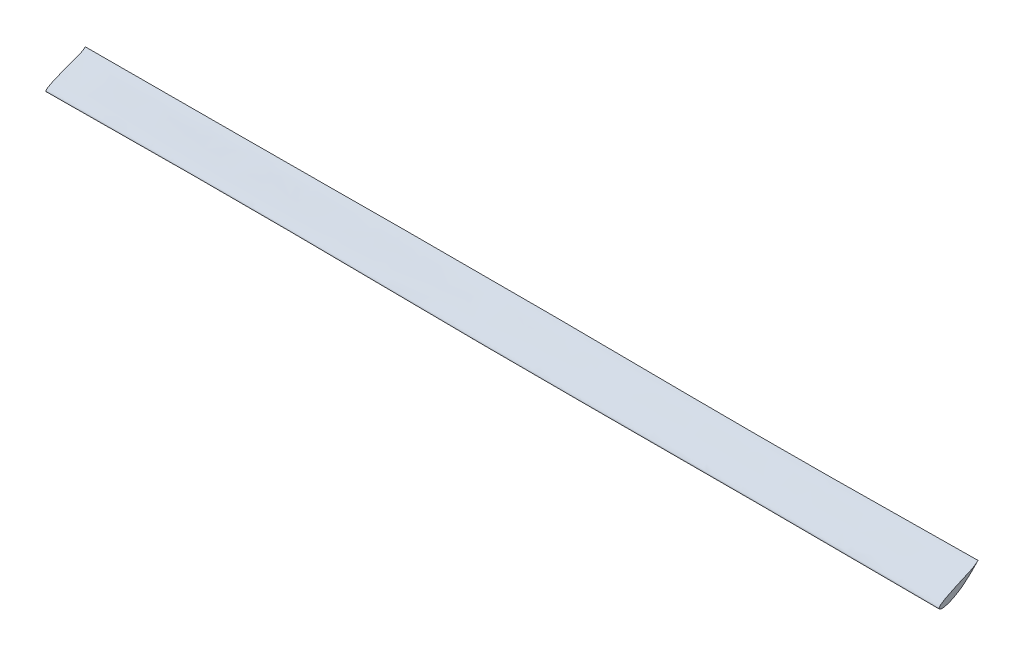
ISO-10303-21;
HEADER;
FILE_DESCRIPTION(('STEP AP214'),'2;1');
FILE_NAME('part.step','',(''),(''),'','','');
FILE_SCHEMA(('AUTOMOTIVE_DESIGN { 1 0 10303 214 1 1 1 1 }'));
ENDSEC;
DATA;
#1=APPLICATION_CONTEXT('core data for automotive mechanical design processes');
#2=APPLICATION_PROTOCOL_DEFINITION('international standard','automotive_design',2000,#1);
#3=PRODUCT_CONTEXT('',#1,'mechanical');
#4=PRODUCT('Part','Part','',(#3));
#5=PRODUCT_RELATED_PRODUCT_CATEGORY('part','',(#4));
#6=PRODUCT_DEFINITION_FORMATION('','',#4);
#7=PRODUCT_DEFINITION_CONTEXT('part definition',#1,'design');
#8=PRODUCT_DEFINITION('design','',#6,#7);
#9=PRODUCT_DEFINITION_SHAPE('','',#8);
#10=(LENGTH_UNIT() NAMED_UNIT(*) SI_UNIT(.MILLI.,.METRE.));
#11=(NAMED_UNIT(*) PLANE_ANGLE_UNIT() SI_UNIT($,.RADIAN.));
#12=(NAMED_UNIT(*) SI_UNIT($,.STERADIAN.) SOLID_ANGLE_UNIT());
#13=UNCERTAINTY_MEASURE_WITH_UNIT(LENGTH_MEASURE(1.E-05),#10,'distance_accuracy_value','');
#14=(GEOMETRIC_REPRESENTATION_CONTEXT(3) GLOBAL_UNCERTAINTY_ASSIGNED_CONTEXT((#13)) GLOBAL_UNIT_ASSIGNED_CONTEXT((#10,
#11,#12)) REPRESENTATION_CONTEXT('',''));
#15=CARTESIAN_POINT('',(0.,0.,0.));
#16=DIRECTION('',(0.,0.,1.));
#17=DIRECTION('',(1.,0.,0.));
#18=AXIS2_PLACEMENT_3D('',#15,#16,#17);
#19=CARTESIAN_POINT('',(997.019750859984,23.5445932351853,-31.5919798363942));
#20=DIRECTION('',(1.,0.,0.));
#21=DIRECTION('',(0.,0.,-1.));
#22=AXIS2_PLACEMENT_3D('',#19,#20,#21);
#23=PLANE('',#22);
#24=CARTESIAN_POINT('',(997.019750859984,35.4339005781969,-54.10357532692));
#25=CARTESIAN_POINT('',(997.019750859984,34.2381881895794,-52.8955230255901));
#26=CARTESIAN_POINT('',(997.019750859984,32.1428343468748,-50.2360352412443));
#27=CARTESIAN_POINT('',(997.019750859984,29.6938278537414,-45.7981714533343));
#28=CARTESIAN_POINT('',(997.019750859984,27.6735843988713,-41.1787572420392));
#29=CARTESIAN_POINT('',(997.019750859984,25.7176513120445,-36.5225225253925));
#30=CARTESIAN_POINT('',(997.019750859984,23.695720292381,-31.894572560708));
#31=CARTESIAN_POINT('',(997.019750859984,21.5984931931603,-27.3081732984461));
#32=CARTESIAN_POINT('',(997.019750859984,19.4455955790061,-22.7564956841988));
#33=CARTESIAN_POINT('',(997.019750859984,17.5082778691136,-19.0387125988831));
#34=CARTESIAN_POINT('',(997.019750859984,15.8538747820841,-16.1253914306171));
#35=CARTESIAN_POINT('',(997.019750859984,14.7486241627605,-14.3447709325331));
#36=CARTESIAN_POINT('',(997.019750859984,13.798577758102,-12.9569555017875));
#37=CARTESIAN_POINT('',(997.019750859984,13.0042141147821,-11.9524705075148));
#38=CARTESIAN_POINT('',(997.019750859984,11.9509988926326,-10.8600952656026));
#39=CARTESIAN_POINT('',(997.019750859984,10.9287179976586,-10.3342016372565));
#40=CARTESIAN_POINT('',(997.019750859984,10.2024209056551,-10.6788708378612));
#41=B_SPLINE_CURVE_WITH_KNOTS('',3,(#24,#25,#26,#27,#28,#29,#30,#31,#32,#33,#34,#35,#36,#37,#38,
#39,#40),.UNSPECIFIED.,.F.,.F.,(4,1,1,1,1,1,1,1,1,1,1,1,1,1,4),(0.,0.0994502667406111,
0.197535442889514,0.296052562977772,0.394806356808814,0.493450979662712,0.591940996969297,
0.690286731259081,0.788438582066012,0.837480949450307,0.886562535047494,0.911178481655704,
0.935996245563337,0.961487145328943,1.),.UNSPECIFIED.);
#42=CARTESIAN_POINT('',(997.019750859984,10.2024209056551,-10.6788708378612));
#43=VERTEX_POINT('',#42);
#44=CARTESIAN_POINT('',(997.019750859984,35.4339005781969,-54.10357532692));
#45=VERTEX_POINT('',#44);
#46=EDGE_CURVE('E60',#43,#45,#41,.F.);
#47=ORIENTED_EDGE('',*,*,#46,.F.);
#48=CARTESIAN_POINT('',(997.019750859984,10.2024209056551,-10.6788708378612));
#49=CARTESIAN_POINT('',(997.019750859984,9.53216321875651,-11.1904140364192));
#50=CARTESIAN_POINT('',(997.019750859984,9.14745858945485,-12.4362131774804));
#51=CARTESIAN_POINT('',(997.019750859984,9.05729615795471,-14.1752019618341));
#52=CARTESIAN_POINT('',(997.019750859984,9.15989810619456,-15.5901834868764));
#53=CARTESIAN_POINT('',(997.019750859984,9.43036237564233,-17.3559755452917));
#54=CARTESIAN_POINT('',(997.019750859984,9.96453582628308,-19.4660487541451));
#55=CARTESIAN_POINT('',(997.019750859984,11.0827536415392,-22.6853781510137));
#56=CARTESIAN_POINT('',(997.019750859984,12.8232789365591,-26.5267046993073));
#57=CARTESIAN_POINT('',(997.019750859984,15.2532400414026,-30.9385941988985));
#58=CARTESIAN_POINT('',(997.019750859984,17.9854624447831,-35.1779101738743));
#59=CARTESIAN_POINT('',(997.019750859984,21.0567921584213,-39.2152051247754));
#60=CARTESIAN_POINT('',(997.019750859984,24.3934392452951,-43.0946377459128));
#61=CARTESIAN_POINT('',(997.019750859984,27.9556329108987,-46.834343905403));
#62=CARTESIAN_POINT('',(997.019750859984,31.6525993706431,-50.4968423811324));
#63=CARTESIAN_POINT('',(997.019750859984,34.1843384422545,-52.8862952058577));
#64=CARTESIAN_POINT('',(997.019750859984,35.4339005781969,-54.10357532692));
#65=B_SPLINE_CURVE_WITH_KNOTS('',3,(#48,#49,#50,#51,#52,#53,#54,#55,#56,#57,#58,#59,#60,#61,#62,
#63,#64),.UNSPECIFIED.,.F.,.F.,(4,1,1,1,1,1,1,1,1,1,1,1,1,1,4),(0.,0.0439009675766793,
0.0724931974140234,0.0990463982397024,0.124643035702787,0.174283288293371,0.222881713336981,
0.31883035285832,0.41429919096017,0.509891636581509,0.60612378963281,0.703302686626897,
0.801511361886123,0.900533646948853,1.),.UNSPECIFIED.);
#66=EDGE_CURVE('E96',#45,#43,#65,.F.);
#67=ORIENTED_EDGE('',*,*,#66,.F.);
#68=EDGE_LOOP('',(#47,#67));
#69=FACE_BOUND('',#68,.T.);
#70=ADVANCED_FACE('F57',(#69),#23,.T.);
#71=CARTESIAN_POINT('',(0.,23.484223991255,-31.7011060039401));
#72=DIRECTION('',(1.,0.,0.));
#73=DIRECTION('',(0.,0.,-1.));
#74=AXIS2_PLACEMENT_3D('',#71,#72,#73);
#75=PLANE('',#74);
#76=CARTESIAN_POINT('',(0.,33.4718637070637,-54.3097643297301));
#77=CARTESIAN_POINT('',(0.,32.395776073136,-53.0586742504488));
#78=CARTESIAN_POINT('',(0.,30.5468507342221,-50.3408636441683));
#79=CARTESIAN_POINT('',(0.,28.476047650665,-45.8767302196085));
#80=CARTESIAN_POINT('',(0.,26.8328108478623,-41.2658512957863));
#81=CARTESIAN_POINT('',(0.,25.2543553945098,-36.623674473178));
#82=CARTESIAN_POINT('',(0.,23.6100632017207,-32.0044143131714));
#83=CARTESIAN_POINT('',(0.,21.8900292839443,-27.4202880068344));
#84=CARTESIAN_POINT('',(0.,20.1137239707885,-22.8660129390922));
#85=CARTESIAN_POINT('',(0.,18.4896405150433,-19.13397699365));
#86=CARTESIAN_POINT('',(0.,17.084988176991,-16.2002424969715));
#87=CARTESIAN_POINT('',(0.,16.1353498503008,-14.4007637609852));
#88=CARTESIAN_POINT('',(0.,15.3093801529886,-12.9922393722692));
#89=CARTESIAN_POINT('',(0.,14.6081852314093,-11.9655257350319));
#90=CARTESIAN_POINT('',(0.,13.662257675184,-10.8361332014463));
#91=CARTESIAN_POINT('',(0.,12.7078642109712,-10.2574690494851));
#92=CARTESIAN_POINT('',(0.,11.9810754589233,-10.542010721781));
#93=B_SPLINE_CURVE_WITH_KNOTS('',3,(#76,#77,#78,#79,#80,#81,#82,#83,#84,#85,#86,#87,#88,#89,#90,
#91,#92),.UNSPECIFIED.,.F.,.F.,(4,1,1,1,1,1,1,1,1,1,1,1,1,1,4),(0.,0.0994502667406111,
0.197535442889514,0.296052562977772,0.394806356808814,0.493450979662712,0.591940996969297,
0.690286731259081,0.788438582066012,0.837480949450307,0.886562535047494,0.911178481655704,
0.935996245563337,0.961487145328943,1.),.UNSPECIFIED.);
#94=CARTESIAN_POINT('',(0.,33.4718637070637,-54.3097643297301));
#95=VERTEX_POINT('',#94);
#96=CARTESIAN_POINT('',(0.,11.9810754589233,-10.542010721781));
#97=VERTEX_POINT('',#96);
#98=EDGE_CURVE('E13',#95,#97,#93,.T.);
#99=ORIENTED_EDGE('',*,*,#98,.F.);
#100=CARTESIAN_POINT('',(0.,11.9810754589233,-10.542010721781));
#101=CARTESIAN_POINT('',(0.,11.297240795926,-10.9919689316582));
#102=CARTESIAN_POINT('',(0.,10.8401547295533,-12.1724139891022));
#103=CARTESIAN_POINT('',(0.,10.6348750572766,-13.8504860760179));
#104=CARTESIAN_POINT('',(0.,10.6382631297944,-15.2278368902834));
#105=CARTESIAN_POINT('',(0.,10.7804276026314,-16.9563295140538));
#106=CARTESIAN_POINT('',(0.,11.1546378085893,-19.0361417787975));
#107=CARTESIAN_POINT('',(0.,12.0192446516231,-22.2298709050762));
#108=CARTESIAN_POINT('',(0.,13.4443570594694,-26.0682083226455));
#109=CARTESIAN_POINT('',(0.,15.4984768125264,-30.5058941070354));
#110=CARTESIAN_POINT('',(0.,17.8570386432198,-34.796947575819));
#111=CARTESIAN_POINT('',(0.,20.5577249067278,-38.9153485367814));
#112=CARTESIAN_POINT('',(0.,23.5260756529886,-42.8988588139013));
#113=CARTESIAN_POINT('',(0.,26.7223431998189,-46.76234503904));
#114=CARTESIAN_POINT('',(0.,30.0543735669652,-50.5601984947121));
#115=CARTESIAN_POINT('',(0.,32.3442492337358,-53.0460845084862));
#116=CARTESIAN_POINT('',(0.,33.4718637070637,-54.3097643297301));
#117=B_SPLINE_CURVE_WITH_KNOTS('',3,(#100,#101,#102,#103,#104,#105,#106,#107,#108,#109,#110,
#111,#112,#113,#114,#115,#116),.UNSPECIFIED.,.F.,.F.,(4,1,1,1,1,1,1,1,1,1,1,1,1,1,4),(0.,
0.0439009675766793,0.0724931974140234,0.0990463982397024,0.124643035702787,0.174283288293371,
0.222881713336981,0.31883035285832,0.41429919096017,0.509891636581509,0.60612378963281,
0.703302686626897,0.801511361886123,0.900533646948853,1.),.UNSPECIFIED.);
#118=EDGE_CURVE('E82',#97,#95,#117,.T.);
#119=ORIENTED_EDGE('',*,*,#118,.F.);
#120=EDGE_LOOP('',(#99,#119));
#121=FACE_BOUND('',#120,.T.);
#122=ADVANCED_FACE('F83',(#121),#75,.F.);
#123=CARTESIAN_POINT('',(0.,33.4718637070637,-54.3097643297301));
#124=CARTESIAN_POINT('',(83.0859867707033,32.8071008862623,-55.1417101007224));
#125=CARTESIAN_POINT('',(249.260752391024,31.4775529055104,-56.8056295999877));
#126=CARTESIAN_POINT('',(498.502499993131,35.6921147759633,-54.2441742416372));
#127=CARTESIAN_POINT('',(747.765567123492,34.3733725005139,-52.0764746851676));
#128=CARTESIAN_POINT('',(913.935056215163,35.0803913605153,-53.4278753835547));
#129=CARTESIAN_POINT('',(997.019750859984,35.4339005781969,-54.10357532692));
#130=CARTESIAN_POINT('',(0.,32.395776073136,-53.0586742504488));
#131=CARTESIAN_POINT('',(83.0860002892271,31.7773784069316,-53.865937855725));
#132=CARTESIAN_POINT('',(249.260792945389,30.540561854047,-55.4804921806572));
#133=CARTESIAN_POINT('',(498.502502939345,34.4713888141207,-53.0244780978808));
#134=CARTESIAN_POINT('',(747.765595333459,33.2225655790473,-50.9598825088056));
#135=CARTESIAN_POINT('',(913.935065618482,33.8996474549547,-52.2503097783405));
#136=CARTESIAN_POINT('',(997.019750859984,34.2381881895794,-52.8955230255901));
#137=CARTESIAN_POINT('',(0.,30.5468507342221,-50.3408636441683));
#138=CARTESIAN_POINT('',(83.0860271407145,30.0198118703724,-51.096838222434));
#139=CARTESIAN_POINT('',(249.260873497456,28.9657151194863,-52.6088127430501));
#140=CARTESIAN_POINT('',(498.502508791332,32.3307616450238,-50.3554433577343));
#141=CARTESIAN_POINT('',(747.765651366174,31.218611502527,-48.48884995889));
#142=CARTESIAN_POINT('',(913.935084296046,31.8347601887793,-49.6536403803187));
#143=CARTESIAN_POINT('',(997.019750859984,32.1428343468748,-50.2360352412443));
#144=CARTESIAN_POINT('',(0.,28.476047650665,-45.8767302196085));
#145=CARTESIAN_POINT('',(83.0860673838808,28.0851916507993,-46.5507412888388));
#146=CARTESIAN_POINT('',(249.260994223364,27.303463896179,-47.8987859969449));
#147=CARTESIAN_POINT('',(498.502517561887,29.8183392101019,-45.9338413492298));
#148=CARTESIAN_POINT('',(747.76573534416,28.9088069946644,-44.3487148762068));
#149=CARTESIAN_POINT('',(913.935112288697,29.4321543388239,-45.3150194544139));
#150=CARTESIAN_POINT('',(997.019750859984,29.6938278537414,-45.7981714533343));
#151=CARTESIAN_POINT('',(0.,26.8328108478623,-41.2658512957863));
#152=CARTESIAN_POINT('',(83.0861075323738,26.5778429226427,-41.8551964256843));
#153=CARTESIAN_POINT('',(249.261114665261,26.0678945787832,-43.0339063699664));
#154=CARTESIAN_POINT('',(498.50252631181,27.7346754913576,-41.3480221085763));
#155=CARTESIAN_POINT('',(747.765819124586,27.0273612935864,-40.0350146123195));
#156=CARTESIAN_POINT('',(913.935140215494,27.4581767833595,-40.7975098514518));
#157=CARTESIAN_POINT('',(997.019750859984,27.6735843988713,-41.1787572420392));
#158=CARTESIAN_POINT('',(0.,25.2543553945098,-36.623674473178));
#159=CARTESIAN_POINT('',(83.0861477569137,25.1355531956015,-37.1277344256966));
#160=CARTESIAN_POINT('',(249.261235335292,24.8979395726921,-38.1358711091753));
#161=CARTESIAN_POINT('',(498.502535078307,25.7150804528267,-36.7281991978753));
#162=CARTESIAN_POINT('',(747.765903063704,25.2104280834335,-35.686449499476));
#163=CARTESIAN_POINT('',(913.935168195189,25.5485769702053,-36.2438316283423));
#164=CARTESIAN_POINT('',(997.019750859984,25.7176513120445,-36.5225225253925));
#165=CARTESIAN_POINT('',(0.,23.6100632017207,-32.0044143131714));
#166=CARTESIAN_POINT('',(83.0861879777695,23.6273979439397,-32.4236441317436));
#167=CARTESIAN_POINT('',(249.261355994271,23.6620614707647,-33.2621176565802));
#168=CARTESIAN_POINT('',(498.502543844,23.6295911947967,-32.1339743209655));
#169=CARTESIAN_POINT('',(747.765986995134,23.3275331504163,-31.3647992777699));
#170=CARTESIAN_POINT('',(913.935196172321,23.5729912942005,-31.7179815371028));
#171=CARTESIAN_POINT('',(997.019750859984,23.695720292381,-31.894572560708));
#172=CARTESIAN_POINT('',(0.,21.8900292839443,-27.4202880068344));
#173=CARTESIAN_POINT('',(83.0862281431568,22.0433069579423,-27.7553384178285));
#174=CARTESIAN_POINT('',(249.261476486849,22.3498596110884,-28.4254502586825));
#175=CARTESIAN_POINT('',(498.502552597605,21.4689310880977,-27.5780512249992));
#176=CARTESIAN_POINT('',(747.766070810814,21.3691691820082,-27.0826761471783));
#177=CARTESIAN_POINT('',(913.93522411087,21.5220518867169,-27.2330076114534));
#178=CARTESIAN_POINT('',(997.019750859984,21.5984931931603,-27.3081732984461));
#179=CARTESIAN_POINT('',(0.,20.1137239707885,-22.8660129390922));
#180=CARTESIAN_POINT('',(83.0862682415603,20.4027155178179,-23.1174298787459));
#181=CARTESIAN_POINT('',(249.261596778482,20.9806991742696,-23.6202719265051));
#182=CARTESIAN_POINT('',(498.502561336611,19.2527203354211,-23.0543656586222));
#183=CARTESIAN_POINT('',(747.766154486715,19.354910157766,-22.8335505863742));
#184=CARTESIAN_POINT('',(913.935252002826,19.4153671173629,-22.7821806413063));
#185=CARTESIAN_POINT('',(997.019750859984,19.4455955790061,-22.7564956841988));
#186=CARTESIAN_POINT('',(0.,18.4896405150433,-19.13397699365));
#187=CARTESIAN_POINT('',(83.0863016184209,18.8916160106176,-19.3167871871261));
#188=CARTESIAN_POINT('',(249.261696906086,19.6955702760506,-19.6824134037796));
#189=CARTESIAN_POINT('',(498.502568610731,17.2625867725647,-19.353837056523));
#190=CARTESIAN_POINT('',(747.766224136343,17.532933751119,-19.3645812451592));
#191=CARTESIAN_POINT('',(913.935275219359,17.5164964931579,-19.1473354374822));
#192=CARTESIAN_POINT('',(997.019750859984,17.5082778691136,-19.0387125988831));
#193=CARTESIAN_POINT('',(0.,17.084988176991,-16.2002424969715));
#194=CARTESIAN_POINT('',(83.0863282986825,17.5773320961902,-16.3289625991825));
#195=CARTESIAN_POINT('',(249.26177694449,18.5620253784462,-16.586406789052));
#196=CARTESIAN_POINT('',(498.502574425401,15.5656458730216,-16.449798478635));
#197=CARTESIAN_POINT('',(747.76627981175,15.9705709933164,-16.6478978375714));
#198=CARTESIAN_POINT('',(913.93529377782,15.8927735035864,-16.2995601631976));
#199=CARTESIAN_POINT('',(997.019750859984,15.8538747820841,-16.1253914306171));
#200=CARTESIAN_POINT('',(0.,16.1353498503008,-14.4007637609852));
#201=CARTESIAN_POINT('',(83.0863449830244,16.6842524427402,-14.4961666872095));
#202=CARTESIAN_POINT('',(249.261826996028,17.7820644297967,-14.6869753888751));
#203=CARTESIAN_POINT('',(498.50257806157,14.4335105670184,-14.6719363704148));
#204=CARTESIAN_POINT('',(747.766314628032,14.9227352842095,-14.9887203868973));
#205=CARTESIAN_POINT('',(913.935305383243,14.8066611800053,-14.5594206647081));
#206=CARTESIAN_POINT('',(997.019750859984,14.7486241627605,-14.3447709325331));
#207=CARTESIAN_POINT('',(0.,15.3093801529886,-12.9922393722692));
#208=CARTESIAN_POINT('',(83.0863583744553,15.9037472885557,-13.0613651675718));
#209=CARTESIAN_POINT('',(249.261867169126,17.0924894544071,-13.1996187110217));
#210=CARTESIAN_POINT('',(498.502580980085,13.4614740288439,-13.2835485958836));
#211=CARTESIAN_POINT('',(747.766342572787,14.0185663011178,-13.6969862027499));
#212=CARTESIAN_POINT('',(913.935314698158,13.8719072430792,-13.2036323033382));
#213=CARTESIAN_POINT('',(997.019750859984,13.798577758102,-12.9569555017875));
#214=CARTESIAN_POINT('',(0.,14.6081852314093,-11.9655257350319));
#215=CARTESIAN_POINT('',(83.0863685591452,15.237229564424,-12.0152066678568));
#216=CARTESIAN_POINT('',(249.261897722287,16.4953269594388,-12.1145698227691));
#217=CARTESIAN_POINT('',(498.502583199726,12.6497879063858,-12.2753889854156));
#218=CARTESIAN_POINT('',(747.76636382583,13.2587950997774,-12.763954980677));
#219=CARTESIAN_POINT('',(913.935321782503,13.0890744091356,-12.2229652235954));
#220=CARTESIAN_POINT('',(997.019750859984,13.0042141147821,-11.9524705075148));
#221=CARTESIAN_POINT('',(0.,13.662257675184,-10.8361332014463));
#222=CARTESIAN_POINT('',(83.0863806328766,14.3326745691195,-10.8636514736997));
#223=CARTESIAN_POINT('',(249.261933942404,15.673518083837,-10.9186885506745));
#224=CARTESIAN_POINT('',(498.502585831063,11.574456339592,-11.1733247438241));
#225=CARTESIAN_POINT('',(747.766389020857,12.2457980229466,-11.7536202626274));
#226=CARTESIAN_POINT('',(913.935330180842,12.0492652300578,-11.1579368120209));
#227=CARTESIAN_POINT('',(997.019750859984,11.9509988926326,-10.8600952656026));
#228=CARTESIAN_POINT('',(0.,12.7078642109712,-10.2574690494851));
#229=CARTESIAN_POINT('',(83.0863893330672,13.4088789240931,-10.2711918508076));
#230=CARTESIAN_POINT('',(249.261960042199,14.8109188226179,-10.298637513663));
#231=CARTESIAN_POINT('',(498.502587727174,10.5315272870168,-10.6274012741852));
#232=CARTESIAN_POINT('',(747.766407176101,11.2501421858483,-11.2803201017408));
#233=CARTESIAN_POINT('',(913.935336232587,11.0358593508222,-10.6495743324752));
#234=CARTESIAN_POINT('',(997.019750859984,10.9287179976586,-10.3342016372565));
#235=CARTESIAN_POINT('',(0.,11.9810754589233,-10.542010721781));
#236=CARTESIAN_POINT('',(83.086394568216,12.7039468476846,-10.5497968964004));
#237=CARTESIAN_POINT('',(249.261975747179,14.1497006618091,-10.5653691011371));
#238=CARTESIAN_POINT('',(498.502588868118,9.7721350395805,-10.9458310388971));
#239=CARTESIAN_POINT('',(747.76641810062,10.5295309262417,-11.6495428615128));
#240=CARTESIAN_POINT('',(913.935339874092,10.3114575355254,-11.0024280495252));
#241=CARTESIAN_POINT('',(997.019750859984,10.2024209056551,-10.6788708378612));
#242=B_SPLINE_SURFACE_WITH_KNOTS('',3,3,((#123,#124,#125,#126,#127,#128,#129),(#130,#131,#132,
#133,#134,#135,#136),(#137,#138,#139,#140,#141,#142,#143),(#144,#145,#146,#147,#148,#149,#150),
(#151,#152,#153,#154,#155,#156,#157),(#158,#159,#160,#161,#162,#163,#164),(#165,#166,#167,#168,
#169,#170,#171),(#172,#173,#174,#175,#176,#177,#178),(#179,#180,#181,#182,#183,#184,#185),(#186,
#187,#188,#189,#190,#191,#192),(#193,#194,#195,#196,#197,#198,#199),(#200,#201,#202,#203,#204,
#205,#206),(#207,#208,#209,#210,#211,#212,#213),(#214,#215,#216,#217,#218,#219,#220),(#221,#222,
#223,#224,#225,#226,#227),(#228,#229,#230,#231,#232,#233,#234),(#235,#236,#237,#238,#239,#240,
#241)),.UNSPECIFIED.,.F.,.F.,.F.,(4,1,1,1,1,1,1,1,1,1,1,1,1,1,4),(4,1,1,1,4),(0.,
0.0994502667406111,0.197535442889514,0.296052562977772,0.394806356808814,0.493450979662712,
0.591940996969297,0.690286731259081,0.788438582066012,0.837480949450307,0.886562535047494,
0.911178481655704,0.935996245563337,0.961487145328943,1.),(0.,0.249999281805329,
0.500006964759281,0.750003632528501,1.),.UNSPECIFIED.);
#243=CARTESIAN_POINT('',(0.,11.9810754589233,-10.542010721781));
#244=CARTESIAN_POINT('',(83.086394568216,12.7039468476846,-10.5497968964004));
#245=CARTESIAN_POINT('',(249.261975747179,14.1497006618091,-10.5653691011371));
#246=CARTESIAN_POINT('',(498.502588868118,9.7721350395805,-10.9458310388971));
#247=CARTESIAN_POINT('',(747.76641810062,10.5295309262417,-11.6495428615128));
#248=CARTESIAN_POINT('',(913.935339874092,10.3114575355254,-11.0024280495252));
#249=CARTESIAN_POINT('',(997.019750859984,10.2024209056551,-10.6788708378612));
#250=B_SPLINE_CURVE_WITH_KNOTS('',3,(#243,#244,#245,#246,#247,#248,#249),.UNSPECIFIED.,.F.,.F.,
(4,1,1,1,4),(0.,0.249999281805329,0.500006964759281,0.750003632528501,1.),.UNSPECIFIED.);
#251=EDGE_CURVE('E94',#43,#97,#250,.F.);
#252=CARTESIAN_POINT('',(0.,33.4718637070637,-54.3097643297301));
#253=CARTESIAN_POINT('',(83.0859867707033,32.8071008862623,-55.1417101007224));
#254=CARTESIAN_POINT('',(249.260752391024,31.4775529055104,-56.8056295999877));
#255=CARTESIAN_POINT('',(498.502499993131,35.6921147759633,-54.2441742416372));
#256=CARTESIAN_POINT('',(747.765567123492,34.3733725005139,-52.0764746851676));
#257=CARTESIAN_POINT('',(913.935056215163,35.0803913605153,-53.4278753835547));
#258=CARTESIAN_POINT('',(997.019750859984,35.4339005781969,-54.10357532692));
#259=B_SPLINE_CURVE_WITH_KNOTS('',3,(#252,#253,#254,#255,#256,#257,#258),.UNSPECIFIED.,.F.,.F.,
(4,1,1,1,4),(0.,0.249999281805329,0.500006964759281,0.750003632528501,1.),.UNSPECIFIED.);
#260=EDGE_CURVE('E89',#95,#45,#259,.T.);
#261=ORIENTED_EDGE('',*,*,#98,.T.);
#262=ORIENTED_EDGE('',*,*,#251,.F.);
#263=ORIENTED_EDGE('',*,*,#46,.T.);
#264=ORIENTED_EDGE('',*,*,#260,.F.);
#265=EDGE_LOOP('',(#261,#262,#263,#264));
#266=FACE_BOUND('',#265,.T.);
#267=ADVANCED_FACE('F93',(#266),#242,.T.);
#268=CARTESIAN_POINT('',(0.,11.9810754589233,-10.542010721781));
#269=CARTESIAN_POINT('',(83.086394568216,12.7039468476846,-10.5497968964004));
#270=CARTESIAN_POINT('',(249.261975747179,14.1497006618091,-10.5653691011371));
#271=CARTESIAN_POINT('',(498.502588868118,9.7721350395805,-10.9458310388971));
#272=CARTESIAN_POINT('',(747.76641810062,10.5295309262417,-11.6495428615128));
#273=CARTESIAN_POINT('',(913.935339874092,10.3114575355254,-11.0024280495252));
#274=CARTESIAN_POINT('',(997.019750859984,10.2024209056551,-10.6788708378612));
#275=CARTESIAN_POINT('',(0.,11.297240795926,-10.9919689316582));
#276=CARTESIAN_POINT('',(83.0863886006476,11.9963757818209,-11.0173659791911));
#277=CARTESIAN_POINT('',(249.261957845006,13.3946561865311,-11.0681605275062));
#278=CARTESIAN_POINT('',(498.502587567552,9.13253399756409,-11.4222228034951));
#279=CARTESIAN_POINT('',(747.766405647714,9.849257629271,-12.1005666589625));
#280=CARTESIAN_POINT('',(913.935335723125,9.63786131327287,-11.4937981224578));
#281=CARTESIAN_POINT('',(997.019750859984,9.53216321875651,-11.1904140364192));
#282=CARTESIAN_POINT('',(0.,10.8401547295533,-12.1724139891022));
#283=CARTESIAN_POINT('',(83.0863787464657,11.5042575292323,-12.223863312066));
#284=CARTESIAN_POINT('',(249.261928283339,12.8324727045706,-12.3267632965358));
#285=CARTESIAN_POINT('',(498.502585419941,8.77347156108387,-12.628146912784));
#286=CARTESIAN_POINT('',(747.766385084363,9.43552402637424,-13.2555157700904));
#287=CARTESIAN_POINT('',(913.935328868677,9.24348036331393,-12.7093139323334));
#288=CARTESIAN_POINT('',(997.019750859984,9.14745858945485,-12.4362131774804));
#289=CARTESIAN_POINT('',(0.,10.6348750572766,-13.8504860760179));
#290=CARTESIAN_POINT('',(83.0863652828408,11.2524658496137,-13.9351656135509));
#291=CARTESIAN_POINT('',(249.261887893666,12.4876558848753,-14.1045271572597));
#292=CARTESIAN_POINT('',(498.502582485692,8.71023196751114,-14.3268427462794));
#293=CARTESIAN_POINT('',(747.766356988956,9.30164390421089,-14.8774712918895));
#294=CARTESIAN_POINT('',(913.935319503546,9.13874537409428,-14.4092916447891));
#295=CARTESIAN_POINT('',(997.019750859984,9.05729615795471,-14.1752019618341));
#296=CARTESIAN_POINT('',(0.,10.6382631297944,-15.2278368902834));
#297=CARTESIAN_POINT('',(83.0863543073692,11.2183851723359,-15.3386031619024));
#298=CARTESIAN_POINT('',(249.26185496823,12.378636805633,-15.5601390613513));
#299=CARTESIAN_POINT('',(498.502580093708,8.83209580639613,-15.7149917638389));
#300=CARTESIAN_POINT('',(747.766334085738,9.36726471854902,-16.2000549752435));
#301=CARTESIAN_POINT('',(913.935311869143,9.229020282636,-15.7934739016007));
#302=CARTESIAN_POINT('',(997.019750859984,9.15989810619456,-15.5901834868764));
#303=CARTESIAN_POINT('',(0.,10.7804276026314,-16.9563295140538));
#304=CARTESIAN_POINT('',(83.0863404707873,11.3135820093487,-17.0991377924983));
#305=CARTESIAN_POINT('',(249.261813459719,12.3798972424164,-17.3847587961406));
#306=CARTESIAN_POINT('',(498.502577078177,9.12523189677293,-17.4520269903191));
#307=CARTESIAN_POINT('',(747.766305212059,9.5903018843385,-17.8518979137735));
#308=CARTESIAN_POINT('',(913.935302244587,9.48367552386099,-17.5212829352627));
#309=CARTESIAN_POINT('',(997.019750859984,9.43036237564233,-17.3559755452917));
#310=CARTESIAN_POINT('',(0.,11.1546378085893,-19.0361417787975));
#311=CARTESIAN_POINT('',(83.0863236375428,11.6309756194731,-19.2166718573784));
#312=CARTESIAN_POINT('',(249.261762961487,12.5836562987264,-19.5777377456882));
#313=CARTESIAN_POINT('',(498.502573409557,9.68504890101339,-19.5346736108745));
#314=CARTESIAN_POINT('',(747.766270085052,10.0658074848138,-19.8271225363341));
#315=CARTESIAN_POINT('',(913.935290535589,9.99829303227684,-19.5864066333498));
#316=CARTESIAN_POINT('',(997.019750859984,9.96453582628308,-19.4660487541451));
#317=CARTESIAN_POINT('',(0.,12.0192446516231,-22.2298709050762));
#318=CARTESIAN_POINT('',(83.0862972411745,12.4067187517721,-22.4677318802945));
#319=CARTESIAN_POINT('',(249.261683774737,13.1816698813196,-22.9434615147562));
#320=CARTESIAN_POINT('',(498.502567656759,10.842093066715,-22.7219211454707));
#321=CARTESIAN_POINT('',(747.766215002063,11.0913349270701,-22.840457574975));
#322=CARTESIAN_POINT('',(913.9352721746,11.0856140689042,-22.7370712716361));
#323=CARTESIAN_POINT('',(997.019750859984,11.0827536415392,-22.6853781510137));
#324=CARTESIAN_POINT('',(0.,13.4443570594694,-26.0682083226455));
#325=CARTESIAN_POINT('',(83.0862646152118,13.7221578753145,-26.3745426669578));
#326=CARTESIAN_POINT('',(249.26158589976,14.2777598112091,-26.9872213731284));
#327=CARTESIAN_POINT('',(498.502560546288,12.6296331975308,-26.5379207819043));
#328=CARTESIAN_POINT('',(747.766146919382,12.7168074394604,-26.4343378070102));
#329=CARTESIAN_POINT('',(913.935249480382,12.7877884517367,-26.4959157475362));
#330=CARTESIAN_POINT('',(997.019750859984,12.8232789365591,-26.5267046993073));
#331=CARTESIAN_POINT('',(0.,15.4984768125264,-30.5058941070354));
#332=CARTESIAN_POINT('',(83.0862256012341,15.645020152987,-30.8916610451341));
#333=CARTESIAN_POINT('',(249.261468861308,15.9381039953768,-31.6632076470421));
#334=CARTESIAN_POINT('',(498.502552043621,15.1164783955806,-30.9342097157797));
#335=CARTESIAN_POINT('',(747.766065506422,15.0095209316914,-30.5576746933026));
#336=CARTESIAN_POINT('',(913.93522234274,15.1720003706941,-30.8116210812069));
#337=CARTESIAN_POINT('',(997.019750859984,15.2532400414026,-30.9385941988985));
#338=CARTESIAN_POINT('',(0.,17.8570386432198,-34.796947575819));
#339=CARTESIAN_POINT('',(83.0861865487178,17.871982180269,-35.2600659349288));
#340=CARTESIAN_POINT('',(249.261351707243,17.9018632628493,-36.1863180171247));
#341=CARTESIAN_POINT('',(498.502543532554,17.9069170958378,-35.17086749267));
#342=CARTESIAN_POINT('',(747.76598401304,17.6049981482759,-34.5146318577519));
#343=CARTESIAN_POINT('',(913.93519517829,17.8586410633937,-34.9568174903596));
#344=CARTESIAN_POINT('',(997.019750859984,17.9854624447831,-35.1779101738743));
#345=CARTESIAN_POINT('',(0.,20.5577249067278,-38.9153485367814));
#346=CARTESIAN_POINT('',(83.0861472637489,20.439848547017,-39.4538570300749));
#347=CARTESIAN_POINT('',(249.261233855842,20.2040866496451,-40.5308919532271));
#348=CARTESIAN_POINT('',(498.502534970827,21.0394302429985,-39.220018606765));
#349=CARTESIAN_POINT('',(747.765902034586,20.5400790234973,-38.2751523486875));
#350=CARTESIAN_POINT('',(913.93516785215,20.8845545157444,-38.9018543248793));
#351=CARTESIAN_POINT('',(997.019750859984,21.0567921584213,-39.2152051247754));
#352=CARTESIAN_POINT('',(0.,23.5260756529886,-42.8988588139013));
#353=CARTESIAN_POINT('',(83.0861076231494,23.2737018347142,-43.5115868036578));
#354=CARTESIAN_POINT('',(249.26111493758,22.7689417889687,-44.7370632533403));
#355=CARTESIAN_POINT('',(498.502526331594,24.4406658090678,-43.1225333601363));
#356=CARTESIAN_POINT('',(747.765819314013,23.7406694451936,-41.8808642627465));
#357=CARTESIAN_POINT('',(913.935140278636,24.1758493990515,-42.6900467468567));
#358=CARTESIAN_POINT('',(997.019750859984,24.3934392452951,-43.0946377459128));
#359=CARTESIAN_POINT('',(0.,26.7223431998189,-46.76234503904));
#360=CARTESIAN_POINT('',(83.0860676032802,26.333693927716,-47.4484437546833));
#361=CARTESIAN_POINT('',(249.260994881543,25.5563796956462,-48.8206641615983));
#362=CARTESIAN_POINT('',(498.502517609703,28.0710128846957,-46.8948957459187));
#363=CARTESIAN_POINT('',(747.765735801995,27.1669781678322,-45.3489074259182));
#364=CARTESIAN_POINT('',(913.935112441308,27.692748101803,-46.339198610499));
#365=CARTESIAN_POINT('',(997.019750859984,27.9556329108987,-46.834343905403));
#366=CARTESIAN_POINT('',(0.,30.0543735669652,-50.5601984947121));
#367=CARTESIAN_POINT('',(83.0860272724714,29.5280706038116,-51.3193535698735));
#368=CARTESIAN_POINT('',(249.260873892715,28.4754456747648,-52.8376891910295));
#369=CARTESIAN_POINT('',(498.502508820047,31.8385788373226,-50.5956107342381));
#370=CARTESIAN_POINT('',(747.765651641119,30.7279621794634,-48.74028544371));
#371=CARTESIAN_POINT('',(913.935084387694,31.3443870969923,-49.911323636435));
#372=CARTESIAN_POINT('',(997.019750859984,31.6525993706431,-50.4968423811324));
#373=CARTESIAN_POINT('',(0.,32.3442492337358,-53.0460845084862));
#374=CARTESIAN_POINT('',(83.0860002914137,31.7256671045585,-53.853623700626));
#375=CARTESIAN_POINT('',(249.260792951949,30.4884816194581,-55.4687292085443));
#376=CARTESIAN_POINT('',(498.502502939822,34.4186867923789,-53.0135709253929));
#377=CARTESIAN_POINT('',(747.765595338022,33.1692989767344,-50.9498307546184));
#378=CARTESIAN_POINT('',(913.935065620003,33.8459920892226,-52.2408073138998));
#379=CARTESIAN_POINT('',(997.019750859984,34.1843384422545,-52.8862952058577));
#380=CARTESIAN_POINT('',(0.,33.4718637070637,-54.3097643297301));
#381=CARTESIAN_POINT('',(83.0859867707033,32.8071008862623,-55.1417101007224));
#382=CARTESIAN_POINT('',(249.260752391024,31.4775529055104,-56.8056295999877));
#383=CARTESIAN_POINT('',(498.502499993131,35.6921147759633,-54.2441742416372));
#384=CARTESIAN_POINT('',(747.765567123492,34.3733725005139,-52.0764746851676));
#385=CARTESIAN_POINT('',(913.935056215163,35.0803913605153,-53.4278753835547));
#386=CARTESIAN_POINT('',(997.019750859984,35.4339005781969,-54.10357532692));
#387=B_SPLINE_SURFACE_WITH_KNOTS('',3,3,((#268,#269,#270,#271,#272,#273,#274),(#275,#276,#277,
#278,#279,#280,#281),(#282,#283,#284,#285,#286,#287,#288),(#289,#290,#291,#292,#293,#294,#295),
(#296,#297,#298,#299,#300,#301,#302),(#303,#304,#305,#306,#307,#308,#309),(#310,#311,#312,#313,
#314,#315,#316),(#317,#318,#319,#320,#321,#322,#323),(#324,#325,#326,#327,#328,#329,#330),(#331,
#332,#333,#334,#335,#336,#337),(#338,#339,#340,#341,#342,#343,#344),(#345,#346,#347,#348,#349,
#350,#351),(#352,#353,#354,#355,#356,#357,#358),(#359,#360,#361,#362,#363,#364,#365),(#366,#367,
#368,#369,#370,#371,#372),(#373,#374,#375,#376,#377,#378,#379),(#380,#381,#382,#383,#384,#385,
#386)),.UNSPECIFIED.,.F.,.F.,.F.,(4,1,1,1,1,1,1,1,1,1,1,1,1,1,4),(4,1,1,1,4),(0.,
0.0439009675766793,0.0724931974140234,0.0990463982397024,0.124643035702787,0.174283288293371,
0.222881713336981,0.31883035285832,0.41429919096017,0.509891636581509,0.60612378963281,
0.703302686626897,0.801511361886123,0.900533646948853,1.),(0.,0.249999281805329,
0.500006964759281,0.750003632528501,1.),.UNSPECIFIED.);
#388=ORIENTED_EDGE('',*,*,#118,.T.);
#389=ORIENTED_EDGE('',*,*,#260,.T.);
#390=ORIENTED_EDGE('',*,*,#66,.T.);
#391=ORIENTED_EDGE('',*,*,#251,.T.);
#392=EDGE_LOOP('',(#388,#389,#390,#391));
#393=FACE_BOUND('',#392,.T.);
#394=ADVANCED_FACE('F95',(#393),#387,.T.);
#395=CLOSED_SHELL('',(#70,#122,#267,#394));
#396=MANIFOLD_SOLID_BREP('B2',#395);
#397=ADVANCED_BREP_SHAPE_REPRESENTATION('',(#18,#396),#14);
#398=SHAPE_DEFINITION_REPRESENTATION(#9,#397);
ENDSEC;
END-ISO-10303-21;
